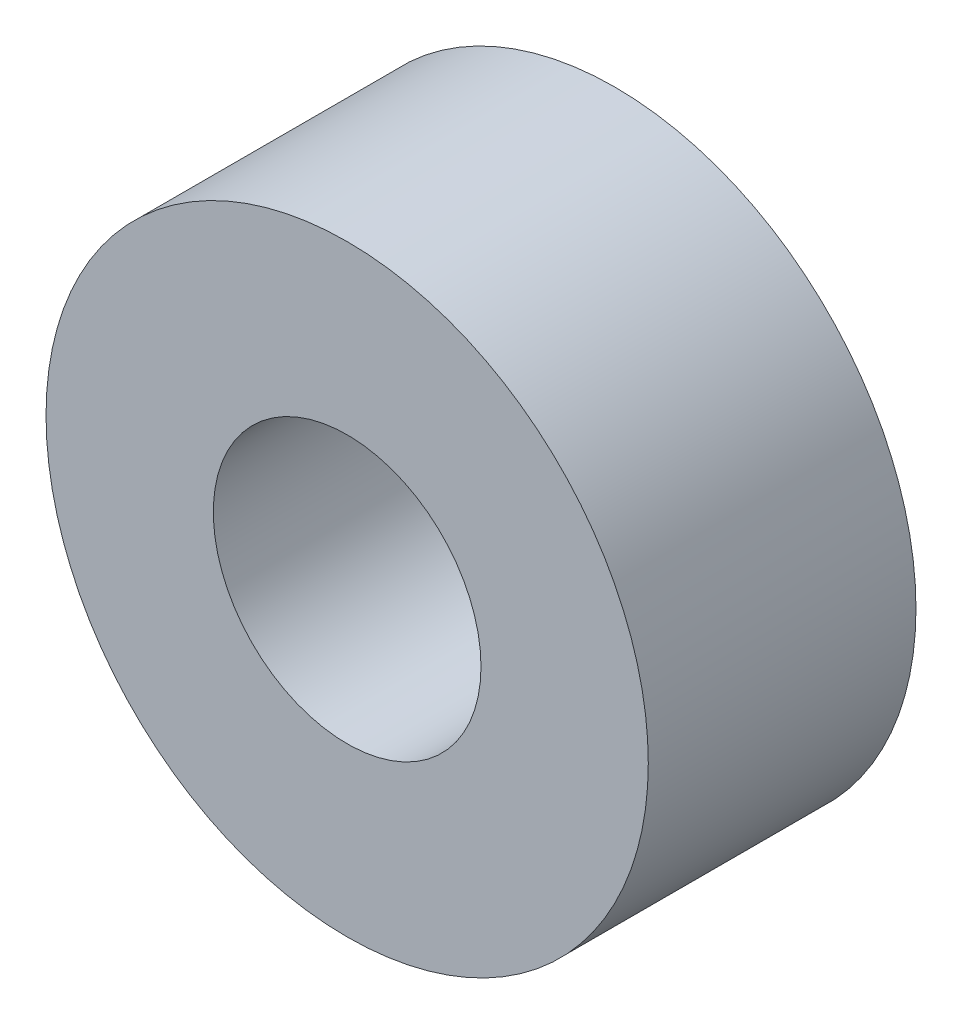
ISO-10303-21;
HEADER;
FILE_DESCRIPTION(('STEP AP214'),'2;1');
FILE_NAME('part.step','',(''),(''),'','','');
FILE_SCHEMA(('AUTOMOTIVE_DESIGN { 1 0 10303 214 1 1 1 1 }'));
ENDSEC;
DATA;
#1=APPLICATION_CONTEXT('core data for automotive mechanical design processes');
#2=APPLICATION_PROTOCOL_DEFINITION('international standard','automotive_design',2000,#1);
#3=PRODUCT_CONTEXT('',#1,'mechanical');
#4=PRODUCT('Part','Part','',(#3));
#5=PRODUCT_RELATED_PRODUCT_CATEGORY('part','',(#4));
#6=PRODUCT_DEFINITION_FORMATION('','',#4);
#7=PRODUCT_DEFINITION_CONTEXT('part definition',#1,'design');
#8=PRODUCT_DEFINITION('design','',#6,#7);
#9=PRODUCT_DEFINITION_SHAPE('','',#8);
#10=(LENGTH_UNIT() NAMED_UNIT(*) SI_UNIT(.MILLI.,.METRE.));
#11=(NAMED_UNIT(*) PLANE_ANGLE_UNIT() SI_UNIT($,.RADIAN.));
#12=(NAMED_UNIT(*) SI_UNIT($,.STERADIAN.) SOLID_ANGLE_UNIT());
#13=UNCERTAINTY_MEASURE_WITH_UNIT(LENGTH_MEASURE(1.E-05),#10,'distance_accuracy_value','');
#14=(GEOMETRIC_REPRESENTATION_CONTEXT(3) GLOBAL_UNCERTAINTY_ASSIGNED_CONTEXT((#13)) GLOBAL_UNIT_ASSIGNED_CONTEXT((#10,
#11,#12)) REPRESENTATION_CONTEXT('',''));
#15=CARTESIAN_POINT('',(0.,0.,0.));
#16=DIRECTION('',(0.,0.,1.));
#17=DIRECTION('',(1.,0.,0.));
#18=AXIS2_PLACEMENT_3D('',#15,#16,#17);
#19=CARTESIAN_POINT('',(0.,0.,2.));
#20=DIRECTION('',(0.,0.,1.));
#21=DIRECTION('',(1.,0.,0.));
#22=AXIS2_PLACEMENT_3D('',#19,#20,#21);
#23=PLANE('',#22);
#24=CARTESIAN_POINT('',(0.,0.,2.));
#25=DIRECTION('',(0.,0.,1.));
#26=DIRECTION('',(1.,0.,0.));
#27=AXIS2_PLACEMENT_3D('',#24,#25,#26);
#28=CIRCLE('',#27,4.5);
#29=CARTESIAN_POINT('',(4.5,0.,2.));
#30=VERTEX_POINT('',#29);
#31=EDGE_CURVE('E10',#30,#30,#28,.T.);
#32=ORIENTED_EDGE('',*,*,#31,.T.);
#33=EDGE_LOOP('',(#32));
#34=FACE_BOUND('',#33,.T.);
#35=CARTESIAN_POINT('',(0.,0.,2.));
#36=DIRECTION('',(0.,0.,1.));
#37=DIRECTION('',(1.,0.,0.));
#38=AXIS2_PLACEMENT_3D('',#35,#36,#37);
#39=CIRCLE('',#38,2.);
#40=CARTESIAN_POINT('',(2.,0.,2.));
#41=VERTEX_POINT('',#40);
#42=EDGE_CURVE('E42',#41,#41,#39,.T.);
#43=ORIENTED_EDGE('',*,*,#42,.F.);
#44=EDGE_LOOP('',(#43));
#45=FACE_BOUND('',#44,.T.);
#46=ADVANCED_FACE('F31',(#34,#45),#23,.T.);
#47=CARTESIAN_POINT('',(0.,0.,-2.));
#48=DIRECTION('',(0.,0.,1.));
#49=DIRECTION('',(1.,0.,0.));
#50=AXIS2_PLACEMENT_3D('',#47,#48,#49);
#51=PLANE('',#50);
#52=CARTESIAN_POINT('',(0.,0.,-2.));
#53=DIRECTION('',(0.,0.,1.));
#54=DIRECTION('',(1.,0.,0.));
#55=AXIS2_PLACEMENT_3D('',#52,#53,#54);
#56=CIRCLE('',#55,4.5);
#57=CARTESIAN_POINT('',(4.5,0.,-2.));
#58=VERTEX_POINT('',#57);
#59=EDGE_CURVE('E35',#58,#58,#56,.T.);
#60=ORIENTED_EDGE('',*,*,#59,.F.);
#61=EDGE_LOOP('',(#60));
#62=FACE_BOUND('',#61,.T.);
#63=CARTESIAN_POINT('',(0.,0.,-2.));
#64=DIRECTION('',(0.,0.,1.));
#65=DIRECTION('',(1.,0.,0.));
#66=AXIS2_PLACEMENT_3D('',#63,#64,#65);
#67=CIRCLE('',#66,2.);
#68=CARTESIAN_POINT('',(2.,0.,-2.));
#69=VERTEX_POINT('',#68);
#70=EDGE_CURVE('E44',#69,#69,#67,.T.);
#71=ORIENTED_EDGE('',*,*,#70,.T.);
#72=EDGE_LOOP('',(#71));
#73=FACE_BOUND('',#72,.T.);
#74=ADVANCED_FACE('F54',(#62,#73),#51,.F.);
#75=CARTESIAN_POINT('',(0.,0.,2.));
#76=DIRECTION('',(0.,0.,-1.));
#77=DIRECTION('',(-1.,0.,0.));
#78=AXIS2_PLACEMENT_3D('',#75,#76,#77);
#79=CYLINDRICAL_SURFACE('',#78,4.5);
#80=ORIENTED_EDGE('',*,*,#31,.F.);
#81=EDGE_LOOP('',(#80));
#82=FACE_BOUND('',#81,.T.);
#83=ORIENTED_EDGE('',*,*,#59,.T.);
#84=EDGE_LOOP('',(#83));
#85=FACE_BOUND('',#84,.T.);
#86=ADVANCED_FACE('F33',(#82,#85),#79,.T.);
#87=CARTESIAN_POINT('',(0.,0.,2.));
#88=DIRECTION('',(0.,0.,-1.));
#89=DIRECTION('',(-1.,0.,0.));
#90=AXIS2_PLACEMENT_3D('',#87,#88,#89);
#91=CYLINDRICAL_SURFACE('',#90,2.);
#92=ORIENTED_EDGE('',*,*,#42,.T.);
#93=EDGE_LOOP('',(#92));
#94=FACE_BOUND('',#93,.T.);
#95=ORIENTED_EDGE('',*,*,#70,.F.);
#96=EDGE_LOOP('',(#95));
#97=FACE_BOUND('',#96,.T.);
#98=ADVANCED_FACE('F50',(#94,#97),#91,.F.);
#99=CLOSED_SHELL('',(#46,#74,#86,#98));
#100=MANIFOLD_SOLID_BREP('B2',#99);
#101=ADVANCED_BREP_SHAPE_REPRESENTATION('',(#18,#100),#14);
#102=SHAPE_DEFINITION_REPRESENTATION(#9,#101);
ENDSEC;
END-ISO-10303-21;
